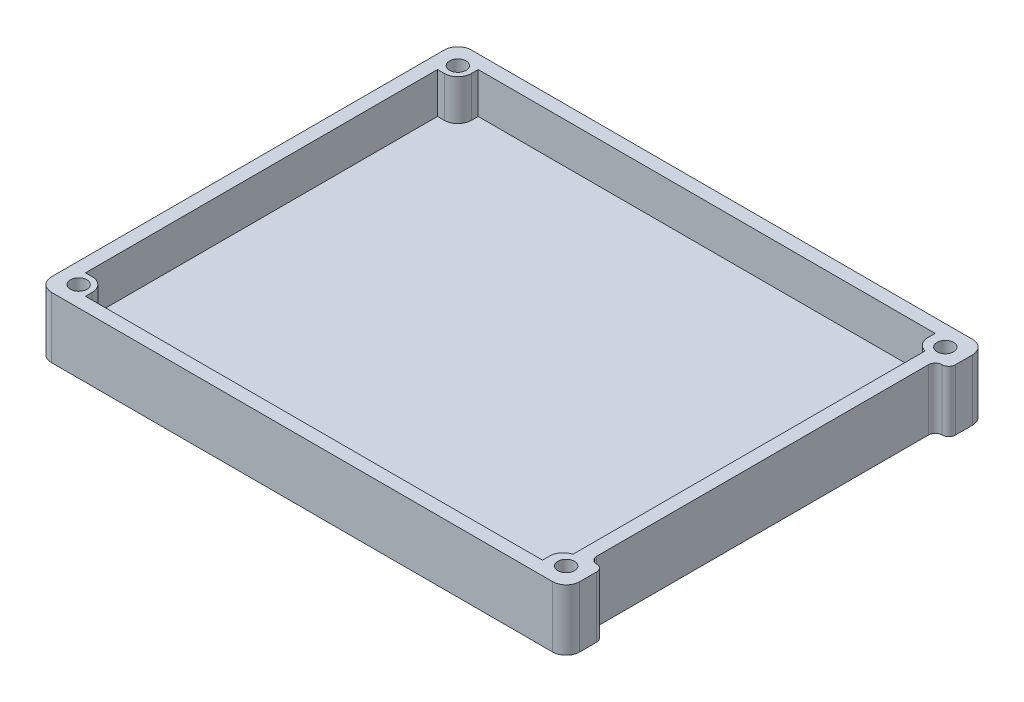
ISO-10303-21;
HEADER;
FILE_DESCRIPTION(('STEP AP214'),'2;1');
FILE_NAME('part.step','',(''),(''),'','','');
FILE_SCHEMA(('AUTOMOTIVE_DESIGN { 1 0 10303 214 1 1 1 1 }'));
ENDSEC;
DATA;
#1=APPLICATION_CONTEXT('core data for automotive mechanical design processes');
#2=APPLICATION_PROTOCOL_DEFINITION('international standard','automotive_design',2000,#1);
#3=PRODUCT_CONTEXT('',#1,'mechanical');
#4=PRODUCT('Part','Part','',(#3));
#5=PRODUCT_RELATED_PRODUCT_CATEGORY('part','',(#4));
#6=PRODUCT_DEFINITION_FORMATION('','',#4);
#7=PRODUCT_DEFINITION_CONTEXT('part definition',#1,'design');
#8=PRODUCT_DEFINITION('design','',#6,#7);
#9=PRODUCT_DEFINITION_SHAPE('','',#8);
#10=(LENGTH_UNIT() NAMED_UNIT(*) SI_UNIT(.MILLI.,.METRE.));
#11=(NAMED_UNIT(*) PLANE_ANGLE_UNIT() SI_UNIT($,.RADIAN.));
#12=(NAMED_UNIT(*) SI_UNIT($,.STERADIAN.) SOLID_ANGLE_UNIT());
#13=UNCERTAINTY_MEASURE_WITH_UNIT(LENGTH_MEASURE(1.E-05),#10,'distance_accuracy_value','');
#14=(GEOMETRIC_REPRESENTATION_CONTEXT(3) GLOBAL_UNCERTAINTY_ASSIGNED_CONTEXT((#13)) GLOBAL_UNIT_ASSIGNED_CONTEXT((#10,
#11,#12)) REPRESENTATION_CONTEXT('',''));
#15=CARTESIAN_POINT('',(0.,0.,0.));
#16=DIRECTION('',(0.,0.,1.));
#17=DIRECTION('',(1.,0.,0.));
#18=AXIS2_PLACEMENT_3D('',#15,#16,#17);
#19=CARTESIAN_POINT('',(40.5,-3.,-25.5));
#20=DIRECTION('',(-1.,0.,0.));
#21=DIRECTION('',(0.,0.,1.));
#22=AXIS2_PLACEMENT_3D('',#19,#20,#21);
#23=PLANE('',#22);
#24=DIRECTION('',(0.,0.,-1.));
#25=VECTOR('',#24,1.);
#26=CARTESIAN_POINT('',(40.5,6.,-25.5));
#27=LINE('',#26,#25);
#28=CARTESIAN_POINT('',(40.5,6.,-26.5));
#29=VERTEX_POINT('',#28);
#30=CARTESIAN_POINT('',(40.5,6.,-29.));
#31=VERTEX_POINT('',#30);
#32=EDGE_CURVE('E232',#29,#31,#27,.T.);
#33=ORIENTED_EDGE('',*,*,#32,.F.);
#34=DIRECTION('',(0.,1.,0.));
#35=VECTOR('',#34,1.);
#36=CARTESIAN_POINT('',(40.5,-3.,-26.5));
#37=LINE('',#36,#35);
#38=CARTESIAN_POINT('',(40.5,-3.,-26.5));
#39=VERTEX_POINT('',#38);
#40=EDGE_CURVE('E324',#29,#39,#37,.F.);
#41=ORIENTED_EDGE('',*,*,#40,.T.);
#42=DIRECTION('',(0.,0.,1.));
#43=VECTOR('',#42,1.);
#44=CARTESIAN_POINT('',(40.5,-3.,-25.5));
#45=LINE('',#44,#43);
#46=CARTESIAN_POINT('',(40.5,-3.,-29.));
#47=VERTEX_POINT('',#46);
#48=EDGE_CURVE('E361',#47,#39,#45,.T.);
#49=ORIENTED_EDGE('',*,*,#48,.F.);
#50=DIRECTION('',(0.,1.,0.));
#51=VECTOR('',#50,1.);
#52=CARTESIAN_POINT('',(40.5,-3.,-29.));
#53=LINE('',#52,#51);
#54=EDGE_CURVE('E278',#47,#31,#53,.T.);
#55=ORIENTED_EDGE('',*,*,#54,.T.);
#56=EDGE_LOOP('',(#33,#41,#49,#55));
#57=FACE_BOUND('',#56,.T.);
#58=ADVANCED_FACE('F36',(#57),#23,.F.);
#59=CARTESIAN_POINT('',(38.5,-3.,25.5));
#60=DIRECTION('',(-1.,0.,0.));
#61=DIRECTION('',(0.,0.,1.));
#62=AXIS2_PLACEMENT_3D('',#59,#60,#61);
#63=PLANE('',#62);
#64=DIRECTION('',(0.,0.,1.));
#65=VECTOR('',#64,1.);
#66=CARTESIAN_POINT('',(38.5,-3.,25.5));
#67=LINE('',#66,#65);
#68=CARTESIAN_POINT('',(38.5,-3.,-24.5));
#69=VERTEX_POINT('',#68);
#70=CARTESIAN_POINT('',(38.5,-3.,24.5));
#71=VERTEX_POINT('',#70);
#72=EDGE_CURVE('E365',#69,#71,#67,.T.);
#73=ORIENTED_EDGE('',*,*,#72,.F.);
#74=DIRECTION('',(0.,1.,0.));
#75=VECTOR('',#74,1.);
#76=CARTESIAN_POINT('',(38.5,6.,-24.5));
#77=LINE('',#76,#75);
#78=CARTESIAN_POINT('',(38.5,6.,-24.5));
#79=VERTEX_POINT('',#78);
#80=EDGE_CURVE('E317',#69,#79,#77,.T.);
#81=ORIENTED_EDGE('',*,*,#80,.T.);
#82=DIRECTION('',(0.,0.,-1.));
#83=VECTOR('',#82,1.);
#84=CARTESIAN_POINT('',(38.5,6.,-25.5));
#85=LINE('',#84,#83);
#86=CARTESIAN_POINT('',(38.5,6.,24.5));
#87=VERTEX_POINT('',#86);
#88=EDGE_CURVE('E355',#87,#79,#85,.T.);
#89=ORIENTED_EDGE('',*,*,#88,.F.);
#90=DIRECTION('',(0.,1.,0.));
#91=VECTOR('',#90,1.);
#92=CARTESIAN_POINT('',(38.5,-3.,24.5));
#93=LINE('',#92,#91);
#94=EDGE_CURVE('E315',#87,#71,#93,.F.);
#95=ORIENTED_EDGE('',*,*,#94,.T.);
#96=EDGE_LOOP('',(#73,#81,#89,#95));
#97=FACE_BOUND('',#96,.T.);
#98=ADVANCED_FACE('F359',(#97),#63,.F.);
#99=CARTESIAN_POINT('',(40.5,-3.,31.));
#100=DIRECTION('',(-1.,0.,0.));
#101=DIRECTION('',(0.,0.,1.));
#102=AXIS2_PLACEMENT_3D('',#99,#100,#101);
#103=PLANE('',#102);
#104=DIRECTION('',(0.,0.,1.));
#105=VECTOR('',#104,1.);
#106=CARTESIAN_POINT('',(40.5,-3.,31.));
#107=LINE('',#106,#105);
#108=CARTESIAN_POINT('',(40.5,-3.,26.5));
#109=VERTEX_POINT('',#108);
#110=CARTESIAN_POINT('',(40.5,-3.,29.));
#111=VERTEX_POINT('',#110);
#112=EDGE_CURVE('E372',#109,#111,#107,.T.);
#113=ORIENTED_EDGE('',*,*,#112,.F.);
#114=DIRECTION('',(0.,1.,0.));
#115=VECTOR('',#114,1.);
#116=CARTESIAN_POINT('',(40.5,-3.,26.5));
#117=LINE('',#116,#115);
#118=CARTESIAN_POINT('',(40.5,6.,26.5));
#119=VERTEX_POINT('',#118);
#120=EDGE_CURVE('E329',#109,#119,#117,.T.);
#121=ORIENTED_EDGE('',*,*,#120,.T.);
#122=DIRECTION('',(0.,0.,-1.));
#123=VECTOR('',#122,1.);
#124=CARTESIAN_POINT('',(40.5,6.,31.));
#125=LINE('',#124,#123);
#126=CARTESIAN_POINT('',(40.5,6.,29.));
#127=VERTEX_POINT('',#126);
#128=EDGE_CURVE('E362',#127,#119,#125,.T.);
#129=ORIENTED_EDGE('',*,*,#128,.F.);
#130=DIRECTION('',(0.,1.,0.));
#131=VECTOR('',#130,1.);
#132=CARTESIAN_POINT('',(40.5,-3.,29.));
#133=LINE('',#132,#131);
#134=EDGE_CURVE('E312',#127,#111,#133,.F.);
#135=ORIENTED_EDGE('',*,*,#134,.T.);
#136=EDGE_LOOP('',(#113,#121,#129,#135));
#137=FACE_BOUND('',#136,.T.);
#138=ADVANCED_FACE('F496',(#137),#103,.F.);
#139=CARTESIAN_POINT('',(-37.5,-3.,31.));
#140=DIRECTION('',(0.,0.,-1.));
#141=DIRECTION('',(-1.,0.,0.));
#142=AXIS2_PLACEMENT_3D('',#139,#140,#141);
#143=PLANE('',#142);
#144=DIRECTION('',(-1.,0.,0.));
#145=VECTOR('',#144,1.);
#146=CARTESIAN_POINT('',(-37.5,-3.,31.));
#147=LINE('',#146,#145);
#148=CARTESIAN_POINT('',(38.5,-3.,31.));
#149=VERTEX_POINT('',#148);
#150=CARTESIAN_POINT('',(-35.5,-3.,31.));
#151=VERTEX_POINT('',#150);
#152=EDGE_CURVE('E374',#149,#151,#147,.T.);
#153=ORIENTED_EDGE('',*,*,#152,.F.);
#154=DIRECTION('',(0.,1.,0.));
#155=VECTOR('',#154,1.);
#156=CARTESIAN_POINT('',(38.5,-3.,31.));
#157=LINE('',#156,#155);
#158=CARTESIAN_POINT('',(38.5,6.,31.));
#159=VERTEX_POINT('',#158);
#160=EDGE_CURVE('E309',#149,#159,#157,.T.);
#161=ORIENTED_EDGE('',*,*,#160,.T.);
#162=DIRECTION('',(1.,0.,0.));
#163=VECTOR('',#162,1.);
#164=CARTESIAN_POINT('',(-37.5,6.,31.));
#165=LINE('',#164,#163);
#166=CARTESIAN_POINT('',(-35.5,6.,31.));
#167=VERTEX_POINT('',#166);
#168=EDGE_CURVE('E367',#167,#159,#165,.T.);
#169=ORIENTED_EDGE('',*,*,#168,.F.);
#170=DIRECTION('',(0.,1.,0.));
#171=VECTOR('',#170,1.);
#172=CARTESIAN_POINT('',(-35.5,-3.,31.));
#173=LINE('',#172,#171);
#174=EDGE_CURVE('E307',#167,#151,#173,.F.);
#175=ORIENTED_EDGE('',*,*,#174,.T.);
#176=EDGE_LOOP('',(#153,#161,#169,#175));
#177=FACE_BOUND('',#176,.T.);
#178=ADVANCED_FACE('F448',(#177),#143,.F.);
#179=CARTESIAN_POINT('',(-37.5,-3.,31.));
#180=DIRECTION('',(1.,0.,0.));
#181=DIRECTION('',(0.,0.,-1.));
#182=AXIS2_PLACEMENT_3D('',#179,#180,#181);
#183=PLANE('',#182);
#184=DIRECTION('',(0.,0.,1.));
#185=VECTOR('',#184,1.);
#186=CARTESIAN_POINT('',(-37.5,6.,31.));
#187=LINE('',#186,#185);
#188=CARTESIAN_POINT('',(-37.5,6.,-29.));
#189=VERTEX_POINT('',#188);
#190=CARTESIAN_POINT('',(-37.5,6.,29.));
#191=VERTEX_POINT('',#190);
#192=EDGE_CURVE('E440',#189,#191,#187,.T.);
#193=ORIENTED_EDGE('',*,*,#192,.F.);
#194=DIRECTION('',(0.,1.,0.));
#195=VECTOR('',#194,1.);
#196=CARTESIAN_POINT('',(-37.5,-3.,-29.));
#197=LINE('',#196,#195);
#198=CARTESIAN_POINT('',(-37.5,-3.,-29.));
#199=VERTEX_POINT('',#198);
#200=EDGE_CURVE('E305',#189,#199,#197,.F.);
#201=ORIENTED_EDGE('',*,*,#200,.T.);
#202=DIRECTION('',(0.,0.,-1.));
#203=VECTOR('',#202,1.);
#204=CARTESIAN_POINT('',(-37.5,-3.,31.));
#205=LINE('',#204,#203);
#206=CARTESIAN_POINT('',(-37.5,-3.,29.));
#207=VERTEX_POINT('',#206);
#208=EDGE_CURVE('E377',#207,#199,#205,.T.);
#209=ORIENTED_EDGE('',*,*,#208,.F.);
#210=DIRECTION('',(0.,1.,0.));
#211=VECTOR('',#210,1.);
#212=CARTESIAN_POINT('',(-37.5,-3.,29.));
#213=LINE('',#212,#211);
#214=EDGE_CURVE('E302',#207,#191,#213,.T.);
#215=ORIENTED_EDGE('',*,*,#214,.T.);
#216=EDGE_LOOP('',(#193,#201,#209,#215));
#217=FACE_BOUND('',#216,.T.);
#218=ADVANCED_FACE('F459',(#217),#183,.F.);
#219=CARTESIAN_POINT('',(-37.5,-3.,-31.));
#220=DIRECTION('',(0.,0.,1.));
#221=DIRECTION('',(1.,0.,0.));
#222=AXIS2_PLACEMENT_3D('',#219,#220,#221);
#223=PLANE('',#222);
#224=DIRECTION('',(-1.,0.,0.));
#225=VECTOR('',#224,1.);
#226=CARTESIAN_POINT('',(-37.5,6.,-31.));
#227=LINE('',#226,#225);
#228=CARTESIAN_POINT('',(38.5,6.,-31.));
#229=VERTEX_POINT('',#228);
#230=CARTESIAN_POINT('',(-35.5,6.,-31.));
#231=VERTEX_POINT('',#230);
#232=EDGE_CURVE('E437',#229,#231,#227,.T.);
#233=ORIENTED_EDGE('',*,*,#232,.F.);
#234=DIRECTION('',(0.,1.,0.));
#235=VECTOR('',#234,1.);
#236=CARTESIAN_POINT('',(38.5,-3.,-31.));
#237=LINE('',#236,#235);
#238=CARTESIAN_POINT('',(38.5,-3.,-31.));
#239=VERTEX_POINT('',#238);
#240=EDGE_CURVE('E292',#229,#239,#237,.F.);
#241=ORIENTED_EDGE('',*,*,#240,.T.);
#242=DIRECTION('',(1.,0.,0.));
#243=VECTOR('',#242,1.);
#244=CARTESIAN_POINT('',(-37.5,-3.,-31.));
#245=LINE('',#244,#243);
#246=CARTESIAN_POINT('',(-35.5,-3.,-31.));
#247=VERTEX_POINT('',#246);
#248=EDGE_CURVE('E380',#247,#239,#245,.T.);
#249=ORIENTED_EDGE('',*,*,#248,.F.);
#250=DIRECTION('',(0.,1.,0.));
#251=VECTOR('',#250,1.);
#252=CARTESIAN_POINT('',(-35.5,-3.,-31.));
#253=LINE('',#252,#251);
#254=EDGE_CURVE('E289',#247,#231,#253,.T.);
#255=ORIENTED_EDGE('',*,*,#254,.T.);
#256=EDGE_LOOP('',(#233,#241,#249,#255));
#257=FACE_BOUND('',#256,.T.);
#258=ADVANCED_FACE('F468',(#257),#223,.F.);
#259=CARTESIAN_POINT('',(0.,-3.,0.));
#260=DIRECTION('',(0.,-1.,0.));
#261=DIRECTION('',(0.,0.,-1.));
#262=AXIS2_PLACEMENT_3D('',#259,#260,#261);
#263=PLANE('',#262);
#264=CARTESIAN_POINT('',(37.5,-3.,-28.));
#265=DIRECTION('',(0.,-1.,0.));
#266=DIRECTION('',(0.,0.,-1.));
#267=AXIS2_PLACEMENT_3D('',#264,#265,#266);
#268=CIRCLE('',#267,2.5019);
#269=CARTESIAN_POINT('',(37.5,-3.,-30.5019));
#270=VERTEX_POINT('',#269);
#271=EDGE_CURVE('E338',#270,#270,#268,.T.);
#272=ORIENTED_EDGE('',*,*,#271,.F.);
#273=EDGE_LOOP('',(#272));
#274=FACE_BOUND('',#273,.T.);
#275=CARTESIAN_POINT('',(-34.5,-3.,-28.));
#276=DIRECTION('',(0.,-1.,0.));
#277=DIRECTION('',(0.,0.,-1.));
#278=AXIS2_PLACEMENT_3D('',#275,#276,#277);
#279=CIRCLE('',#278,2.5019);
#280=CARTESIAN_POINT('',(-34.5,-3.,-30.5019));
#281=VERTEX_POINT('',#280);
#282=EDGE_CURVE('E923',#281,#281,#279,.T.);
#283=ORIENTED_EDGE('',*,*,#282,.F.);
#284=EDGE_LOOP('',(#283));
#285=FACE_BOUND('',#284,.T.);
#286=CARTESIAN_POINT('',(-34.5,-3.,28.));
#287=DIRECTION('',(0.,-1.,0.));
#288=DIRECTION('',(0.,0.,-1.));
#289=AXIS2_PLACEMENT_3D('',#286,#287,#288);
#290=CIRCLE('',#289,2.5019);
#291=CARTESIAN_POINT('',(-34.5,-3.,25.4981));
#292=VERTEX_POINT('',#291);
#293=EDGE_CURVE('E927',#292,#292,#290,.T.);
#294=ORIENTED_EDGE('',*,*,#293,.F.);
#295=EDGE_LOOP('',(#294));
#296=FACE_BOUND('',#295,.T.);
#297=CARTESIAN_POINT('',(37.5,-3.,28.));
#298=DIRECTION('',(0.,-1.,0.));
#299=DIRECTION('',(0.,0.,-1.));
#300=AXIS2_PLACEMENT_3D('',#297,#298,#299);
#301=CIRCLE('',#300,2.5019);
#302=CARTESIAN_POINT('',(37.5,-3.,25.4981));
#303=VERTEX_POINT('',#302);
#304=EDGE_CURVE('E930',#303,#303,#301,.T.);
#305=ORIENTED_EDGE('',*,*,#304,.F.);
#306=EDGE_LOOP('',(#305));
#307=FACE_BOUND('',#306,.T.);
#308=ORIENTED_EDGE('',*,*,#48,.T.);
#309=CARTESIAN_POINT('',(39.5,-3.,-26.5));
#310=DIRECTION('',(0.,-1.,0.));
#311=DIRECTION('',(0.,0.,-1.));
#312=AXIS2_PLACEMENT_3D('',#309,#310,#311);
#313=CIRCLE('',#312,1.);
#314=CARTESIAN_POINT('',(39.5,-3.,-25.5));
#315=VERTEX_POINT('',#314);
#316=EDGE_CURVE('E327',#39,#315,#313,.T.);
#317=ORIENTED_EDGE('',*,*,#316,.T.);
#318=CARTESIAN_POINT('',(39.5,-3.,-24.5));
#319=DIRECTION('',(0.,-1.,0.));
#320=DIRECTION('',(0.,0.,-1.));
#321=AXIS2_PLACEMENT_3D('',#318,#319,#320);
#322=CIRCLE('',#321,1.);
#323=EDGE_CURVE('E334',#315,#69,#322,.F.);
#324=ORIENTED_EDGE('',*,*,#323,.T.);
#325=ORIENTED_EDGE('',*,*,#72,.T.);
#326=CARTESIAN_POINT('',(39.5,-3.,24.5));
#327=DIRECTION('',(0.,-1.,0.));
#328=DIRECTION('',(0.,0.,-1.));
#329=AXIS2_PLACEMENT_3D('',#326,#327,#328);
#330=CIRCLE('',#329,1.);
#331=CARTESIAN_POINT('',(39.5,-3.,25.5));
#332=VERTEX_POINT('',#331);
#333=EDGE_CURVE('E11',#71,#332,#330,.F.);
#334=ORIENTED_EDGE('',*,*,#333,.T.);
#335=CARTESIAN_POINT('',(39.5,-3.,26.5));
#336=DIRECTION('',(0.,-1.,0.));
#337=DIRECTION('',(0.,0.,-1.));
#338=AXIS2_PLACEMENT_3D('',#335,#336,#337);
#339=CIRCLE('',#338,1.);
#340=EDGE_CURVE('E52',#332,#109,#339,.T.);
#341=ORIENTED_EDGE('',*,*,#340,.T.);
#342=ORIENTED_EDGE('',*,*,#112,.T.);
#343=CARTESIAN_POINT('',(38.5,-3.,29.));
#344=DIRECTION('',(0.,-1.,0.));
#345=DIRECTION('',(0.,0.,-1.));
#346=AXIS2_PLACEMENT_3D('',#343,#344,#345);
#347=CIRCLE('',#346,2.);
#348=EDGE_CURVE('E296',#111,#149,#347,.T.);
#349=ORIENTED_EDGE('',*,*,#348,.T.);
#350=ORIENTED_EDGE('',*,*,#152,.T.);
#351=CARTESIAN_POINT('',(-35.5,-3.,29.));
#352=DIRECTION('',(0.,-1.,0.));
#353=DIRECTION('',(0.,0.,-1.));
#354=AXIS2_PLACEMENT_3D('',#351,#352,#353);
#355=CIRCLE('',#354,2.);
#356=EDGE_CURVE('E294',#151,#207,#355,.T.);
#357=ORIENTED_EDGE('',*,*,#356,.T.);
#358=ORIENTED_EDGE('',*,*,#208,.T.);
#359=CARTESIAN_POINT('',(-35.5,-3.,-29.));
#360=DIRECTION('',(0.,-1.,0.));
#361=DIRECTION('',(0.,0.,-1.));
#362=AXIS2_PLACEMENT_3D('',#359,#360,#361);
#363=CIRCLE('',#362,2.);
#364=EDGE_CURVE('E298',#199,#247,#363,.T.);
#365=ORIENTED_EDGE('',*,*,#364,.T.);
#366=ORIENTED_EDGE('',*,*,#248,.T.);
#367=CARTESIAN_POINT('',(38.5,-3.,-29.));
#368=DIRECTION('',(0.,-1.,0.));
#369=DIRECTION('',(0.,0.,-1.));
#370=AXIS2_PLACEMENT_3D('',#367,#368,#369);
#371=CIRCLE('',#370,2.);
#372=EDGE_CURVE('E300',#239,#47,#371,.T.);
#373=ORIENTED_EDGE('',*,*,#372,.T.);
#374=EDGE_LOOP('',(#308,#317,#324,#325,#334,#341,#342,#349,#350,#357,#358,#365,#366,#373));
#375=FACE_BOUND('',#374,.T.);
#376=ADVANCED_FACE('F455',(#274,#285,#296,#307,#375),#263,.T.);
#377=CARTESIAN_POINT('',(0.,6.,0.));
#378=DIRECTION('',(0.,-1.,0.));
#379=DIRECTION('',(0.,0.,-1.));
#380=AXIS2_PLACEMENT_3D('',#377,#378,#379);
#381=PLANE('',#380);
#382=CARTESIAN_POINT('',(37.5,6.,-28.));
#383=DIRECTION('',(0.,-1.,0.));
#384=DIRECTION('',(0.,0.,-1.));
#385=AXIS2_PLACEMENT_3D('',#382,#383,#384);
#386=CIRCLE('',#385,1.2192);
#387=CARTESIAN_POINT('',(37.5,6.,-29.2192));
#388=VERTEX_POINT('',#387);
#389=EDGE_CURVE('E998',#388,#388,#386,.T.);
#390=ORIENTED_EDGE('',*,*,#389,.T.);
#391=EDGE_LOOP('',(#390));
#392=FACE_BOUND('',#391,.T.);
#393=CARTESIAN_POINT('',(-34.5,6.,-28.));
#394=DIRECTION('',(0.,-1.,0.));
#395=DIRECTION('',(0.,0.,-1.));
#396=AXIS2_PLACEMENT_3D('',#393,#394,#395);
#397=CIRCLE('',#396,1.2192);
#398=CARTESIAN_POINT('',(-34.5,6.,-29.2192));
#399=VERTEX_POINT('',#398);
#400=EDGE_CURVE('E991',#399,#399,#397,.T.);
#401=ORIENTED_EDGE('',*,*,#400,.T.);
#402=EDGE_LOOP('',(#401));
#403=FACE_BOUND('',#402,.T.);
#404=CARTESIAN_POINT('',(-34.5,6.,28.));
#405=DIRECTION('',(0.,-1.,0.));
#406=DIRECTION('',(0.,0.,-1.));
#407=AXIS2_PLACEMENT_3D('',#404,#405,#406);
#408=CIRCLE('',#407,1.2192);
#409=CARTESIAN_POINT('',(-34.5,6.,26.7808));
#410=VERTEX_POINT('',#409);
#411=EDGE_CURVE('E933',#410,#410,#408,.T.);
#412=ORIENTED_EDGE('',*,*,#411,.T.);
#413=EDGE_LOOP('',(#412));
#414=FACE_BOUND('',#413,.T.);
#415=CARTESIAN_POINT('',(37.5,6.,28.));
#416=DIRECTION('',(0.,-1.,0.));
#417=DIRECTION('',(0.,0.,-1.));
#418=AXIS2_PLACEMENT_3D('',#415,#416,#417);
#419=CIRCLE('',#418,1.2192);
#420=CARTESIAN_POINT('',(37.5,6.,26.7808));
#421=VERTEX_POINT('',#420);
#422=EDGE_CURVE('E936',#421,#421,#419,.T.);
#423=ORIENTED_EDGE('',*,*,#422,.T.);
#424=EDGE_LOOP('',(#423));
#425=FACE_BOUND('',#424,.T.);
#426=ORIENTED_EDGE('',*,*,#88,.T.);
#427=CARTESIAN_POINT('',(39.5,6.,-24.5));
#428=DIRECTION('',(0.,-1.,0.));
#429=DIRECTION('',(0.,0.,-1.));
#430=AXIS2_PLACEMENT_3D('',#427,#428,#429);
#431=CIRCLE('',#430,1.);
#432=CARTESIAN_POINT('',(39.5,6.,-25.5));
#433=VERTEX_POINT('',#432);
#434=EDGE_CURVE('E332',#79,#433,#431,.T.);
#435=ORIENTED_EDGE('',*,*,#434,.T.);
#436=CARTESIAN_POINT('',(39.5,6.,-26.5));
#437=DIRECTION('',(0.,-1.,0.));
#438=DIRECTION('',(0.,0.,-1.));
#439=AXIS2_PLACEMENT_3D('',#436,#437,#438);
#440=CIRCLE('',#439,1.);
#441=EDGE_CURVE('E322',#433,#29,#440,.F.);
#442=ORIENTED_EDGE('',*,*,#441,.T.);
#443=ORIENTED_EDGE('',*,*,#32,.T.);
#444=CARTESIAN_POINT('',(38.5,6.,-29.));
#445=DIRECTION('',(0.,-1.,0.));
#446=DIRECTION('',(0.,0.,-1.));
#447=AXIS2_PLACEMENT_3D('',#444,#445,#446);
#448=CIRCLE('',#447,2.);
#449=EDGE_CURVE('E287',#31,#229,#448,.F.);
#450=ORIENTED_EDGE('',*,*,#449,.T.);
#451=ORIENTED_EDGE('',*,*,#232,.T.);
#452=CARTESIAN_POINT('',(-35.5,6.,-29.));
#453=DIRECTION('',(0.,-1.,0.));
#454=DIRECTION('',(0.,0.,-1.));
#455=AXIS2_PLACEMENT_3D('',#452,#453,#454);
#456=CIRCLE('',#455,2.);
#457=EDGE_CURVE('E285',#231,#189,#456,.F.);
#458=ORIENTED_EDGE('',*,*,#457,.T.);
#459=ORIENTED_EDGE('',*,*,#192,.T.);
#460=CARTESIAN_POINT('',(-35.5,6.,29.));
#461=DIRECTION('',(0.,-1.,0.));
#462=DIRECTION('',(0.,0.,-1.));
#463=AXIS2_PLACEMENT_3D('',#460,#461,#462);
#464=CIRCLE('',#463,2.);
#465=EDGE_CURVE('E281',#191,#167,#464,.F.);
#466=ORIENTED_EDGE('',*,*,#465,.T.);
#467=ORIENTED_EDGE('',*,*,#168,.T.);
#468=CARTESIAN_POINT('',(38.5,6.,29.));
#469=DIRECTION('',(0.,-1.,0.));
#470=DIRECTION('',(0.,0.,-1.));
#471=AXIS2_PLACEMENT_3D('',#468,#469,#470);
#472=CIRCLE('',#471,2.);
#473=EDGE_CURVE('E283',#159,#127,#472,.F.);
#474=ORIENTED_EDGE('',*,*,#473,.T.);
#475=ORIENTED_EDGE('',*,*,#128,.T.);
#476=CARTESIAN_POINT('',(39.5,6.,26.5));
#477=DIRECTION('',(0.,-1.,0.));
#478=DIRECTION('',(0.,0.,-1.));
#479=AXIS2_PLACEMENT_3D('',#476,#477,#478);
#480=CIRCLE('',#479,1.);
#481=CARTESIAN_POINT('',(39.5,6.,25.5));
#482=VERTEX_POINT('',#481);
#483=EDGE_CURVE('E320',#119,#482,#480,.F.);
#484=ORIENTED_EDGE('',*,*,#483,.T.);
#485=CARTESIAN_POINT('',(39.5,6.,24.5));
#486=DIRECTION('',(0.,-1.,0.));
#487=DIRECTION('',(0.,0.,-1.));
#488=AXIS2_PLACEMENT_3D('',#485,#486,#487);
#489=CIRCLE('',#488,1.);
#490=EDGE_CURVE('E45',#482,#87,#489,.T.);
#491=ORIENTED_EDGE('',*,*,#490,.T.);
#492=EDGE_LOOP('',(#426,#435,#442,#443,#450,#451,#458,#459,#466,#467,#474,#475,#484,#491));
#493=FACE_BOUND('',#492,.T.);
#494=DIRECTION('',(-1.,0.,0.));
#495=VECTOR('',#494,1.);
#496=CARTESIAN_POINT('',(-35.5,6.,-26.));
#497=LINE('',#496,#495);
#498=CARTESIAN_POINT('',(-34.5,6.,-26.));
#499=VERTEX_POINT('',#498);
#500=CARTESIAN_POINT('',(-35.5,6.,-26.));
#501=VERTEX_POINT('',#500);
#502=EDGE_CURVE('E951',#499,#501,#497,.T.);
#503=ORIENTED_EDGE('',*,*,#502,.F.);
#504=CARTESIAN_POINT('',(-34.5,6.,-28.));
#505=DIRECTION('',(0.,-1.,0.));
#506=DIRECTION('',(0.,0.,-1.));
#507=AXIS2_PLACEMENT_3D('',#504,#505,#506);
#508=CIRCLE('',#507,2.);
#509=CARTESIAN_POINT('',(-32.5,6.,-28.));
#510=VERTEX_POINT('',#509);
#511=EDGE_CURVE('E260',#499,#510,#508,.F.);
#512=ORIENTED_EDGE('',*,*,#511,.T.);
#513=DIRECTION('',(0.,0.,1.));
#514=VECTOR('',#513,1.);
#515=CARTESIAN_POINT('',(-32.5,6.,-29.));
#516=LINE('',#515,#514);
#517=CARTESIAN_POINT('',(-32.5,6.,-29.));
#518=VERTEX_POINT('',#517);
#519=EDGE_CURVE('E393',#518,#510,#516,.T.);
#520=ORIENTED_EDGE('',*,*,#519,.F.);
#521=DIRECTION('',(-1.,0.,0.));
#522=VECTOR('',#521,1.);
#523=CARTESIAN_POINT('',(-32.5,6.,-29.));
#524=LINE('',#523,#522);
#525=CARTESIAN_POINT('',(35.,6.,-29.));
#526=VERTEX_POINT('',#525);
#527=EDGE_CURVE('E948',#526,#518,#524,.T.);
#528=ORIENTED_EDGE('',*,*,#527,.F.);
#529=DIRECTION('',(0.,0.,-1.));
#530=VECTOR('',#529,1.);
#531=CARTESIAN_POINT('',(35.,6.,-29.));
#532=LINE('',#531,#530);
#533=CARTESIAN_POINT('',(35.,6.,-27.9364916731037));
#534=VERTEX_POINT('',#533);
#535=EDGE_CURVE('E244',#534,#526,#532,.T.);
#536=ORIENTED_EDGE('',*,*,#535,.F.);
#537=CARTESIAN_POINT('',(37.,6.,-27.9364916731037));
#538=DIRECTION('',(0.,-1.,0.));
#539=DIRECTION('',(0.,0.,-1.));
#540=AXIS2_PLACEMENT_3D('',#537,#538,#539);
#541=CIRCLE('',#540,2.);
#542=CARTESIAN_POINT('',(36.5,6.,-26.));
#543=VERTEX_POINT('',#542);
#544=EDGE_CURVE('E243',#534,#543,#541,.F.);
#545=ORIENTED_EDGE('',*,*,#544,.T.);
#546=DIRECTION('',(0.,0.,-1.));
#547=VECTOR('',#546,1.);
#548=CARTESIAN_POINT('',(36.5,6.,26.));
#549=LINE('',#548,#547);
#550=CARTESIAN_POINT('',(36.5,6.,26.));
#551=VERTEX_POINT('',#550);
#552=EDGE_CURVE('E226',#551,#543,#549,.T.);
#553=ORIENTED_EDGE('',*,*,#552,.F.);
#554=CARTESIAN_POINT('',(37.,6.,27.9364916731037));
#555=DIRECTION('',(0.,-1.,0.));
#556=DIRECTION('',(0.,0.,-1.));
#557=AXIS2_PLACEMENT_3D('',#554,#555,#556);
#558=CIRCLE('',#557,2.);
#559=CARTESIAN_POINT('',(35.,6.,27.9364916731037));
#560=VERTEX_POINT('',#559);
#561=EDGE_CURVE('E239',#551,#560,#558,.F.);
#562=ORIENTED_EDGE('',*,*,#561,.T.);
#563=DIRECTION('',(0.,0.,-1.));
#564=VECTOR('',#563,1.);
#565=CARTESIAN_POINT('',(35.,6.,29.));
#566=LINE('',#565,#564);
#567=CARTESIAN_POINT('',(35.,6.,29.));
#568=VERTEX_POINT('',#567);
#569=EDGE_CURVE('E245',#568,#560,#566,.T.);
#570=ORIENTED_EDGE('',*,*,#569,.F.);
#571=DIRECTION('',(1.,0.,0.));
#572=VECTOR('',#571,1.);
#573=CARTESIAN_POINT('',(-32.5,6.,29.));
#574=LINE('',#573,#572);
#575=CARTESIAN_POINT('',(-32.5,6.,29.));
#576=VERTEX_POINT('',#575);
#577=EDGE_CURVE('E422',#576,#568,#574,.T.);
#578=ORIENTED_EDGE('',*,*,#577,.F.);
#579=DIRECTION('',(0.,0.,1.));
#580=VECTOR('',#579,1.);
#581=CARTESIAN_POINT('',(-32.5,6.,29.));
#582=LINE('',#581,#580);
#583=CARTESIAN_POINT('',(-32.5,6.,28.));
#584=VERTEX_POINT('',#583);
#585=EDGE_CURVE('E958',#584,#576,#582,.T.);
#586=ORIENTED_EDGE('',*,*,#585,.F.);
#587=CARTESIAN_POINT('',(-34.5,6.,28.));
#588=DIRECTION('',(0.,-1.,0.));
#589=DIRECTION('',(0.,0.,-1.));
#590=AXIS2_PLACEMENT_3D('',#587,#588,#589);
#591=CIRCLE('',#590,2.);
#592=CARTESIAN_POINT('',(-34.5,6.,26.));
#593=VERTEX_POINT('',#592);
#594=EDGE_CURVE('E251',#584,#593,#591,.F.);
#595=ORIENTED_EDGE('',*,*,#594,.T.);
#596=DIRECTION('',(1.,0.,0.));
#597=VECTOR('',#596,1.);
#598=CARTESIAN_POINT('',(-35.5,6.,26.));
#599=LINE('',#598,#597);
#600=CARTESIAN_POINT('',(-35.5,6.,26.));
#601=VERTEX_POINT('',#600);
#602=EDGE_CURVE('E955',#601,#593,#599,.T.);
#603=ORIENTED_EDGE('',*,*,#602,.F.);
#604=DIRECTION('',(0.,0.,1.));
#605=VECTOR('',#604,1.);
#606=CARTESIAN_POINT('',(-35.5,6.,26.));
#607=LINE('',#606,#605);
#608=EDGE_CURVE('E953',#501,#601,#607,.T.);
#609=ORIENTED_EDGE('',*,*,#608,.F.);
#610=EDGE_LOOP('',(#503,#512,#520,#528,#536,#545,#553,#562,#570,#578,#586,#595,#603,#609));
#611=FACE_BOUND('',#610,.T.);
#612=ADVANCED_FACE('F237',(#392,#403,#414,#425,#493,#611),#381,.F.);
#613=CARTESIAN_POINT('',(35.,6.,29.));
#614=DIRECTION('',(-1.,0.,0.));
#615=DIRECTION('',(0.,0.,1.));
#616=AXIS2_PLACEMENT_3D('',#613,#614,#615);
#617=PLANE('',#616);
#618=ORIENTED_EDGE('',*,*,#569,.T.);
#619=DIRECTION('',(0.,-1.,0.));
#620=VECTOR('',#619,1.);
#621=CARTESIAN_POINT('',(35.,0.,27.9364916731037));
#622=LINE('',#621,#620);
#623=CARTESIAN_POINT('',(35.,0.,27.9364916731037));
#624=VERTEX_POINT('',#623);
#625=EDGE_CURVE('E250',#560,#624,#622,.T.);
#626=ORIENTED_EDGE('',*,*,#625,.T.);
#627=DIRECTION('',(0.,0.,-1.));
#628=VECTOR('',#627,1.);
#629=CARTESIAN_POINT('',(35.,0.,29.));
#630=LINE('',#629,#628);
#631=CARTESIAN_POINT('',(35.,0.,29.));
#632=VERTEX_POINT('',#631);
#633=EDGE_CURVE('E945',#632,#624,#630,.T.);
#634=ORIENTED_EDGE('',*,*,#633,.F.);
#635=DIRECTION('',(0.,-1.,0.));
#636=VECTOR('',#635,1.);
#637=CARTESIAN_POINT('',(35.,6.,29.));
#638=LINE('',#637,#636);
#639=EDGE_CURVE('E419',#568,#632,#638,.T.);
#640=ORIENTED_EDGE('',*,*,#639,.F.);
#641=EDGE_LOOP('',(#618,#626,#634,#640));
#642=FACE_BOUND('',#641,.T.);
#643=ADVANCED_FACE('F768',(#642),#617,.T.);
#644=CARTESIAN_POINT('',(36.5,6.,26.));
#645=DIRECTION('',(-1.,0.,0.));
#646=DIRECTION('',(0.,0.,1.));
#647=AXIS2_PLACEMENT_3D('',#644,#645,#646);
#648=PLANE('',#647);
#649=DIRECTION('',(0.,0.,-1.));
#650=VECTOR('',#649,1.);
#651=CARTESIAN_POINT('',(36.5,0.,26.));
#652=LINE('',#651,#650);
#653=CARTESIAN_POINT('',(36.5,0.,26.));
#654=VERTEX_POINT('',#653);
#655=CARTESIAN_POINT('',(36.5,0.,-26.));
#656=VERTEX_POINT('',#655);
#657=EDGE_CURVE('E229',#654,#656,#652,.T.);
#658=ORIENTED_EDGE('',*,*,#657,.F.);
#659=DIRECTION('',(0.,-1.,0.));
#660=VECTOR('',#659,1.);
#661=CARTESIAN_POINT('',(36.5,6.,26.));
#662=LINE('',#661,#660);
#663=EDGE_CURVE('E222',#551,#654,#662,.T.);
#664=ORIENTED_EDGE('',*,*,#663,.F.);
#665=ORIENTED_EDGE('',*,*,#552,.T.);
#666=DIRECTION('',(0.,-1.,0.));
#667=VECTOR('',#666,1.);
#668=CARTESIAN_POINT('',(36.5,6.,-26.));
#669=LINE('',#668,#667);
#670=EDGE_CURVE('E233',#543,#656,#669,.T.);
#671=ORIENTED_EDGE('',*,*,#670,.T.);
#672=EDGE_LOOP('',(#658,#664,#665,#671));
#673=FACE_BOUND('',#672,.T.);
#674=ADVANCED_FACE('F224',(#673),#648,.T.);
#675=CARTESIAN_POINT('',(35.,6.,-29.));
#676=DIRECTION('',(-1.,0.,0.));
#677=DIRECTION('',(0.,0.,1.));
#678=AXIS2_PLACEMENT_3D('',#675,#676,#677);
#679=PLANE('',#678);
#680=DIRECTION('',(0.,0.,-1.));
#681=VECTOR('',#680,1.);
#682=CARTESIAN_POINT('',(35.,0.,-29.));
#683=LINE('',#682,#681);
#684=CARTESIAN_POINT('',(35.,0.,-27.9364916731037));
#685=VERTEX_POINT('',#684);
#686=CARTESIAN_POINT('',(35.,0.,-29.));
#687=VERTEX_POINT('',#686);
#688=EDGE_CURVE('E406',#685,#687,#683,.T.);
#689=ORIENTED_EDGE('',*,*,#688,.F.);
#690=DIRECTION('',(0.,1.,0.));
#691=VECTOR('',#690,1.);
#692=CARTESIAN_POINT('',(35.,6.,-27.9364916731037));
#693=LINE('',#692,#691);
#694=EDGE_CURVE('E262',#685,#534,#693,.T.);
#695=ORIENTED_EDGE('',*,*,#694,.T.);
#696=ORIENTED_EDGE('',*,*,#535,.T.);
#697=DIRECTION('',(0.,-1.,0.));
#698=VECTOR('',#697,1.);
#699=CARTESIAN_POINT('',(35.,6.,-29.));
#700=LINE('',#699,#698);
#701=EDGE_CURVE('E432',#526,#687,#700,.T.);
#702=ORIENTED_EDGE('',*,*,#701,.T.);
#703=EDGE_LOOP('',(#689,#695,#696,#702));
#704=FACE_BOUND('',#703,.T.);
#705=ADVANCED_FACE('F750',(#704),#679,.T.);
#706=CARTESIAN_POINT('',(-32.5,6.,-29.));
#707=DIRECTION('',(0.,0.,1.));
#708=DIRECTION('',(0.,-1.,0.));
#709=AXIS2_PLACEMENT_3D('',#706,#707,#708);
#710=PLANE('',#709);
#711=DIRECTION('',(-1.,0.,0.));
#712=VECTOR('',#711,1.);
#713=CARTESIAN_POINT('',(-32.5,0.,-29.));
#714=LINE('',#713,#712);
#715=CARTESIAN_POINT('',(-32.5,0.,-29.));
#716=VERTEX_POINT('',#715);
#717=EDGE_CURVE('E401',#687,#716,#714,.T.);
#718=ORIENTED_EDGE('',*,*,#717,.F.);
#719=ORIENTED_EDGE('',*,*,#701,.F.);
#720=ORIENTED_EDGE('',*,*,#527,.T.);
#721=DIRECTION('',(0.,-1.,0.));
#722=VECTOR('',#721,1.);
#723=CARTESIAN_POINT('',(-32.5,6.,-29.));
#724=LINE('',#723,#722);
#725=EDGE_CURVE('E430',#518,#716,#724,.T.);
#726=ORIENTED_EDGE('',*,*,#725,.T.);
#727=EDGE_LOOP('',(#718,#719,#720,#726));
#728=FACE_BOUND('',#727,.T.);
#729=ADVANCED_FACE('F741',(#728),#710,.T.);
#730=CARTESIAN_POINT('',(-32.5,6.,-29.));
#731=DIRECTION('',(1.,0.,0.));
#732=DIRECTION('',(0.,0.,-1.));
#733=AXIS2_PLACEMENT_3D('',#730,#731,#732);
#734=PLANE('',#733);
#735=ORIENTED_EDGE('',*,*,#519,.T.);
#736=DIRECTION('',(0.,-1.,0.));
#737=VECTOR('',#736,1.);
#738=CARTESIAN_POINT('',(-32.5,6.,-28.));
#739=LINE('',#738,#737);
#740=CARTESIAN_POINT('',(-32.5,0.,-28.));
#741=VERTEX_POINT('',#740);
#742=EDGE_CURVE('E255',#510,#741,#739,.T.);
#743=ORIENTED_EDGE('',*,*,#742,.T.);
#744=DIRECTION('',(0.,0.,1.));
#745=VECTOR('',#744,1.);
#746=CARTESIAN_POINT('',(-32.5,0.,-29.));
#747=LINE('',#746,#745);
#748=EDGE_CURVE('E390',#716,#741,#747,.T.);
#749=ORIENTED_EDGE('',*,*,#748,.F.);
#750=ORIENTED_EDGE('',*,*,#725,.F.);
#751=EDGE_LOOP('',(#735,#743,#749,#750));
#752=FACE_BOUND('',#751,.T.);
#753=ADVANCED_FACE('F388',(#752),#734,.T.);
#754=CARTESIAN_POINT('',(-35.5,6.,-26.));
#755=DIRECTION('',(0.,0.,1.));
#756=DIRECTION('',(0.,-1.,0.));
#757=AXIS2_PLACEMENT_3D('',#754,#755,#756);
#758=PLANE('',#757);
#759=DIRECTION('',(-1.,0.,0.));
#760=VECTOR('',#759,1.);
#761=CARTESIAN_POINT('',(-35.5,0.,-26.));
#762=LINE('',#761,#760);
#763=CARTESIAN_POINT('',(-34.5,0.,-26.));
#764=VERTEX_POINT('',#763);
#765=CARTESIAN_POINT('',(-35.5,0.,-26.));
#766=VERTEX_POINT('',#765);
#767=EDGE_CURVE('E402',#764,#766,#762,.T.);
#768=ORIENTED_EDGE('',*,*,#767,.F.);
#769=DIRECTION('',(0.,-1.,0.));
#770=VECTOR('',#769,1.);
#771=CARTESIAN_POINT('',(-34.5,6.,-26.));
#772=LINE('',#771,#770);
#773=EDGE_CURVE('E252',#764,#499,#772,.F.);
#774=ORIENTED_EDGE('',*,*,#773,.T.);
#775=ORIENTED_EDGE('',*,*,#502,.T.);
#776=DIRECTION('',(0.,-1.,0.));
#777=VECTOR('',#776,1.);
#778=CARTESIAN_POINT('',(-35.5,6.,-26.));
#779=LINE('',#778,#777);
#780=EDGE_CURVE('E427',#501,#766,#779,.T.);
#781=ORIENTED_EDGE('',*,*,#780,.T.);
#782=EDGE_LOOP('',(#768,#774,#775,#781));
#783=FACE_BOUND('',#782,.T.);
#784=ADVANCED_FACE('F722',(#783),#758,.T.);
#785=CARTESIAN_POINT('',(-35.5,6.,26.));
#786=DIRECTION('',(1.,0.,0.));
#787=DIRECTION('',(0.,0.,-1.));
#788=AXIS2_PLACEMENT_3D('',#785,#786,#787);
#789=PLANE('',#788);
#790=DIRECTION('',(0.,0.,1.));
#791=VECTOR('',#790,1.);
#792=CARTESIAN_POINT('',(-35.5,0.,26.));
#793=LINE('',#792,#791);
#794=CARTESIAN_POINT('',(-35.5,0.,26.));
#795=VERTEX_POINT('',#794);
#796=EDGE_CURVE('E404',#766,#795,#793,.T.);
#797=ORIENTED_EDGE('',*,*,#796,.F.);
#798=ORIENTED_EDGE('',*,*,#780,.F.);
#799=ORIENTED_EDGE('',*,*,#608,.T.);
#800=DIRECTION('',(0.,-1.,0.));
#801=VECTOR('',#800,1.);
#802=CARTESIAN_POINT('',(-35.5,6.,26.));
#803=LINE('',#802,#801);
#804=EDGE_CURVE('E425',#601,#795,#803,.T.);
#805=ORIENTED_EDGE('',*,*,#804,.T.);
#806=EDGE_LOOP('',(#797,#798,#799,#805));
#807=FACE_BOUND('',#806,.T.);
#808=ADVANCED_FACE('F712',(#807),#789,.T.);
#809=CARTESIAN_POINT('',(-35.5,6.,26.));
#810=DIRECTION('',(0.,0.,-1.));
#811=DIRECTION('',(0.,1.,0.));
#812=AXIS2_PLACEMENT_3D('',#809,#810,#811);
#813=PLANE('',#812);
#814=ORIENTED_EDGE('',*,*,#602,.T.);
#815=DIRECTION('',(0.,-1.,0.));
#816=VECTOR('',#815,1.);
#817=CARTESIAN_POINT('',(-34.5,6.,26.));
#818=LINE('',#817,#816);
#819=CARTESIAN_POINT('',(-34.5,0.,26.));
#820=VERTEX_POINT('',#819);
#821=EDGE_CURVE('E264',#593,#820,#818,.T.);
#822=ORIENTED_EDGE('',*,*,#821,.T.);
#823=DIRECTION('',(1.,0.,0.));
#824=VECTOR('',#823,1.);
#825=CARTESIAN_POINT('',(-35.5,0.,26.));
#826=LINE('',#825,#824);
#827=EDGE_CURVE('E412',#795,#820,#826,.T.);
#828=ORIENTED_EDGE('',*,*,#827,.F.);
#829=ORIENTED_EDGE('',*,*,#804,.F.);
#830=EDGE_LOOP('',(#814,#822,#828,#829));
#831=FACE_BOUND('',#830,.T.);
#832=ADVANCED_FACE('F702',(#831),#813,.T.);
#833=CARTESIAN_POINT('',(-32.5,6.,29.));
#834=DIRECTION('',(1.,0.,0.));
#835=DIRECTION('',(0.,0.,-1.));
#836=AXIS2_PLACEMENT_3D('',#833,#834,#835);
#837=PLANE('',#836);
#838=DIRECTION('',(0.,0.,1.));
#839=VECTOR('',#838,1.);
#840=CARTESIAN_POINT('',(-32.5,0.,29.));
#841=LINE('',#840,#839);
#842=CARTESIAN_POINT('',(-32.5,0.,28.));
#843=VERTEX_POINT('',#842);
#844=CARTESIAN_POINT('',(-32.5,0.,29.));
#845=VERTEX_POINT('',#844);
#846=EDGE_CURVE('E415',#843,#845,#841,.T.);
#847=ORIENTED_EDGE('',*,*,#846,.F.);
#848=DIRECTION('',(0.,-1.,0.));
#849=VECTOR('',#848,1.);
#850=CARTESIAN_POINT('',(-32.5,6.,28.));
#851=LINE('',#850,#849);
#852=EDGE_CURVE('E267',#843,#584,#851,.F.);
#853=ORIENTED_EDGE('',*,*,#852,.T.);
#854=ORIENTED_EDGE('',*,*,#585,.T.);
#855=DIRECTION('',(0.,-1.,0.));
#856=VECTOR('',#855,1.);
#857=CARTESIAN_POINT('',(-32.5,6.,29.));
#858=LINE('',#857,#856);
#859=EDGE_CURVE('E421',#576,#845,#858,.T.);
#860=ORIENTED_EDGE('',*,*,#859,.T.);
#861=EDGE_LOOP('',(#847,#853,#854,#860));
#862=FACE_BOUND('',#861,.T.);
#863=ADVANCED_FACE('F690',(#862),#837,.T.);
#864=CARTESIAN_POINT('',(-32.5,6.,29.));
#865=DIRECTION('',(0.,0.,-1.));
#866=DIRECTION('',(0.,1.,0.));
#867=AXIS2_PLACEMENT_3D('',#864,#865,#866);
#868=PLANE('',#867);
#869=DIRECTION('',(1.,0.,0.));
#870=VECTOR('',#869,1.);
#871=CARTESIAN_POINT('',(-32.5,0.,29.));
#872=LINE('',#871,#870);
#873=EDGE_CURVE('E417',#845,#632,#872,.T.);
#874=ORIENTED_EDGE('',*,*,#873,.F.);
#875=ORIENTED_EDGE('',*,*,#859,.F.);
#876=ORIENTED_EDGE('',*,*,#577,.T.);
#877=ORIENTED_EDGE('',*,*,#639,.T.);
#878=EDGE_LOOP('',(#874,#875,#876,#877));
#879=FACE_BOUND('',#878,.T.);
#880=ADVANCED_FACE('F684',(#879),#868,.T.);
#881=CARTESIAN_POINT('',(0.,0.,0.));
#882=DIRECTION('',(0.,-1.,0.));
#883=DIRECTION('',(0.,0.,-1.));
#884=AXIS2_PLACEMENT_3D('',#881,#882,#883);
#885=PLANE('',#884);
#886=ORIENTED_EDGE('',*,*,#873,.T.);
#887=ORIENTED_EDGE('',*,*,#633,.T.);
#888=CARTESIAN_POINT('',(37.,0.,27.9364916731037));
#889=DIRECTION('',(0.,-1.,0.));
#890=DIRECTION('',(0.,0.,-1.));
#891=AXIS2_PLACEMENT_3D('',#888,#889,#890);
#892=CIRCLE('',#891,2.);
#893=EDGE_CURVE('E276',#624,#654,#892,.T.);
#894=ORIENTED_EDGE('',*,*,#893,.T.);
#895=ORIENTED_EDGE('',*,*,#657,.T.);
#896=CARTESIAN_POINT('',(37.,0.,-27.9364916731037));
#897=DIRECTION('',(0.,-1.,0.));
#898=DIRECTION('',(0.,0.,-1.));
#899=AXIS2_PLACEMENT_3D('',#896,#897,#898);
#900=CIRCLE('',#899,2.);
#901=EDGE_CURVE('E272',#656,#685,#900,.T.);
#902=ORIENTED_EDGE('',*,*,#901,.T.);
#903=ORIENTED_EDGE('',*,*,#688,.T.);
#904=ORIENTED_EDGE('',*,*,#717,.T.);
#905=ORIENTED_EDGE('',*,*,#748,.T.);
#906=CARTESIAN_POINT('',(-34.5,0.,-28.));
#907=DIRECTION('',(0.,-1.,0.));
#908=DIRECTION('',(0.,0.,-1.));
#909=AXIS2_PLACEMENT_3D('',#906,#907,#908);
#910=CIRCLE('',#909,2.);
#911=EDGE_CURVE('E270',#741,#764,#910,.T.);
#912=ORIENTED_EDGE('',*,*,#911,.T.);
#913=ORIENTED_EDGE('',*,*,#767,.T.);
#914=ORIENTED_EDGE('',*,*,#796,.T.);
#915=ORIENTED_EDGE('',*,*,#827,.T.);
#916=CARTESIAN_POINT('',(-34.5,0.,28.));
#917=DIRECTION('',(0.,-1.,0.));
#918=DIRECTION('',(0.,0.,-1.));
#919=AXIS2_PLACEMENT_3D('',#916,#917,#918);
#920=CIRCLE('',#919,2.);
#921=EDGE_CURVE('E274',#820,#843,#920,.T.);
#922=ORIENTED_EDGE('',*,*,#921,.T.);
#923=ORIENTED_EDGE('',*,*,#846,.T.);
#924=EDGE_LOOP('',(#886,#887,#894,#895,#902,#903,#904,#905,#912,#913,#914,#915,#922,#923));
#925=FACE_BOUND('',#924,.T.);
#926=ADVANCED_FACE('F398',(#925),#885,.F.);
#927=CARTESIAN_POINT('',(-34.5,6.,-28.));
#928=DIRECTION('',(0.,-1.,0.));
#929=DIRECTION('',(0.,0.,-1.));
#930=AXIS2_PLACEMENT_3D('',#927,#928,#929);
#931=CYLINDRICAL_SURFACE('',#930,2.);
#932=ORIENTED_EDGE('',*,*,#511,.F.);
#933=ORIENTED_EDGE('',*,*,#773,.F.);
#934=ORIENTED_EDGE('',*,*,#911,.F.);
#935=ORIENTED_EDGE('',*,*,#742,.F.);
#936=EDGE_LOOP('',(#932,#933,#934,#935));
#937=FACE_BOUND('',#936,.T.);
#938=ADVANCED_FACE('F500',(#937),#931,.T.);
#939=CARTESIAN_POINT('',(37.,6.,-27.9364916731037));
#940=DIRECTION('',(0.,-1.,0.));
#941=DIRECTION('',(0.,0.,-1.));
#942=AXIS2_PLACEMENT_3D('',#939,#940,#941);
#943=CYLINDRICAL_SURFACE('',#942,2.);
#944=ORIENTED_EDGE('',*,*,#544,.F.);
#945=ORIENTED_EDGE('',*,*,#694,.F.);
#946=ORIENTED_EDGE('',*,*,#901,.F.);
#947=ORIENTED_EDGE('',*,*,#670,.F.);
#948=EDGE_LOOP('',(#944,#945,#946,#947));
#949=FACE_BOUND('',#948,.T.);
#950=ADVANCED_FACE('F503',(#949),#943,.T.);
#951=CARTESIAN_POINT('',(-34.5,6.,28.));
#952=DIRECTION('',(0.,-1.,0.));
#953=DIRECTION('',(0.,0.,-1.));
#954=AXIS2_PLACEMENT_3D('',#951,#952,#953);
#955=CYLINDRICAL_SURFACE('',#954,2.);
#956=ORIENTED_EDGE('',*,*,#594,.F.);
#957=ORIENTED_EDGE('',*,*,#852,.F.);
#958=ORIENTED_EDGE('',*,*,#921,.F.);
#959=ORIENTED_EDGE('',*,*,#821,.F.);
#960=EDGE_LOOP('',(#956,#957,#958,#959));
#961=FACE_BOUND('',#960,.T.);
#962=ADVANCED_FACE('F506',(#961),#955,.T.);
#963=CARTESIAN_POINT('',(37.,6.,27.9364916731037));
#964=DIRECTION('',(0.,1.,0.));
#965=DIRECTION('',(0.,0.,1.));
#966=AXIS2_PLACEMENT_3D('',#963,#964,#965);
#967=CYLINDRICAL_SURFACE('',#966,2.);
#968=ORIENTED_EDGE('',*,*,#561,.F.);
#969=ORIENTED_EDGE('',*,*,#663,.T.);
#970=ORIENTED_EDGE('',*,*,#893,.F.);
#971=ORIENTED_EDGE('',*,*,#625,.F.);
#972=EDGE_LOOP('',(#968,#969,#970,#971));
#973=FACE_BOUND('',#972,.T.);
#974=ADVANCED_FACE('F248',(#973),#967,.T.);
#975=CARTESIAN_POINT('',(37.5,-3.,28.));
#976=DIRECTION('',(0.,-1.,0.));
#977=DIRECTION('',(0.,0.,-1.));
#978=AXIS2_PLACEMENT_3D('',#975,#976,#977);
#979=CYLINDRICAL_SURFACE('',#978,1.2192);
#980=ORIENTED_EDGE('',*,*,#422,.F.);
#981=EDGE_LOOP('',(#980));
#982=FACE_BOUND('',#981,.T.);
#983=CARTESIAN_POINT('',(37.5,-1.52442244405761,28.));
#984=DIRECTION('',(0.,-1.,0.));
#985=DIRECTION('',(0.,0.,-1.));
#986=AXIS2_PLACEMENT_3D('',#983,#984,#985);
#987=CIRCLE('',#986,1.2192);
#988=CARTESIAN_POINT('',(37.5,-1.52442244405761,26.7808));
#989=VERTEX_POINT('',#988);
#990=EDGE_CURVE('E932',#989,#989,#987,.T.);
#991=ORIENTED_EDGE('',*,*,#990,.T.);
#992=EDGE_LOOP('',(#991));
#993=FACE_BOUND('',#992,.T.);
#994=ADVANCED_FACE('F513',(#982,#993),#979,.F.);
#995=CARTESIAN_POINT('',(37.5,-3.,28.));
#996=DIRECTION('',(0.,-1.,0.));
#997=DIRECTION('',(0.,0.,-1.));
#998=AXIS2_PLACEMENT_3D('',#995,#996,#997);
#999=CONICAL_SURFACE('',#998,2.5019,0.715584993317676);
#1000=ORIENTED_EDGE('',*,*,#990,.F.);
#1001=EDGE_LOOP('',(#1000));
#1002=FACE_BOUND('',#1001,.T.);
#1003=ORIENTED_EDGE('',*,*,#304,.T.);
#1004=EDGE_LOOP('',(#1003));
#1005=FACE_BOUND('',#1004,.T.);
#1006=ADVANCED_FACE('F636',(#1002,#1005),#999,.F.);
#1007=CARTESIAN_POINT('',(-34.5,-3.,28.));
#1008=DIRECTION('',(0.,-1.,0.));
#1009=DIRECTION('',(0.,0.,-1.));
#1010=AXIS2_PLACEMENT_3D('',#1007,#1008,#1009);
#1011=CYLINDRICAL_SURFACE('',#1010,1.2192);
#1012=ORIENTED_EDGE('',*,*,#411,.F.);
#1013=EDGE_LOOP('',(#1012));
#1014=FACE_BOUND('',#1013,.T.);
#1015=CARTESIAN_POINT('',(-34.5,-1.52442244405761,28.));
#1016=DIRECTION('',(0.,-1.,0.));
#1017=DIRECTION('',(0.,0.,-1.));
#1018=AXIS2_PLACEMENT_3D('',#1015,#1016,#1017);
#1019=CIRCLE('',#1018,1.2192);
#1020=CARTESIAN_POINT('',(-34.5,-1.52442244405761,26.7808));
#1021=VERTEX_POINT('',#1020);
#1022=EDGE_CURVE('E939',#1021,#1021,#1019,.T.);
#1023=ORIENTED_EDGE('',*,*,#1022,.T.);
#1024=EDGE_LOOP('',(#1023));
#1025=FACE_BOUND('',#1024,.T.);
#1026=ADVANCED_FACE('F626',(#1014,#1025),#1011,.F.);
#1027=CARTESIAN_POINT('',(-34.5,-3.,28.));
#1028=DIRECTION('',(0.,-1.,0.));
#1029=DIRECTION('',(0.,0.,-1.));
#1030=AXIS2_PLACEMENT_3D('',#1027,#1028,#1029);
#1031=CONICAL_SURFACE('',#1030,2.5019,0.715584993317676);
#1032=ORIENTED_EDGE('',*,*,#1022,.F.);
#1033=EDGE_LOOP('',(#1032));
#1034=FACE_BOUND('',#1033,.T.);
#1035=ORIENTED_EDGE('',*,*,#293,.T.);
#1036=EDGE_LOOP('',(#1035));
#1037=FACE_BOUND('',#1036,.T.);
#1038=ADVANCED_FACE('F616',(#1034,#1037),#1031,.F.);
#1039=CARTESIAN_POINT('',(-34.5,-3.,-28.));
#1040=DIRECTION('',(0.,-1.,0.));
#1041=DIRECTION('',(0.,0.,-1.));
#1042=AXIS2_PLACEMENT_3D('',#1039,#1040,#1041);
#1043=CYLINDRICAL_SURFACE('',#1042,1.2192);
#1044=ORIENTED_EDGE('',*,*,#400,.F.);
#1045=EDGE_LOOP('',(#1044));
#1046=FACE_BOUND('',#1045,.T.);
#1047=CARTESIAN_POINT('',(-34.5,-1.52442244405761,-28.));
#1048=DIRECTION('',(0.,-1.,0.));
#1049=DIRECTION('',(0.,0.,-1.));
#1050=AXIS2_PLACEMENT_3D('',#1047,#1048,#1049);
#1051=CIRCLE('',#1050,1.2192);
#1052=CARTESIAN_POINT('',(-34.5,-1.52442244405761,-29.2192));
#1053=VERTEX_POINT('',#1052);
#1054=EDGE_CURVE('E994',#1053,#1053,#1051,.T.);
#1055=ORIENTED_EDGE('',*,*,#1054,.T.);
#1056=EDGE_LOOP('',(#1055));
#1057=FACE_BOUND('',#1056,.T.);
#1058=ADVANCED_FACE('F606',(#1046,#1057),#1043,.F.);
#1059=CARTESIAN_POINT('',(-34.5,-3.,-28.));
#1060=DIRECTION('',(0.,-1.,0.));
#1061=DIRECTION('',(0.,0.,-1.));
#1062=AXIS2_PLACEMENT_3D('',#1059,#1060,#1061);
#1063=CONICAL_SURFACE('',#1062,2.5019,0.715584993317676);
#1064=ORIENTED_EDGE('',*,*,#1054,.F.);
#1065=EDGE_LOOP('',(#1064));
#1066=FACE_BOUND('',#1065,.T.);
#1067=ORIENTED_EDGE('',*,*,#282,.T.);
#1068=EDGE_LOOP('',(#1067));
#1069=FACE_BOUND('',#1068,.T.);
#1070=ADVANCED_FACE('F596',(#1066,#1069),#1063,.F.);
#1071=CARTESIAN_POINT('',(37.5,-3.,-28.));
#1072=DIRECTION('',(0.,-1.,0.));
#1073=DIRECTION('',(0.,0.,-1.));
#1074=AXIS2_PLACEMENT_3D('',#1071,#1072,#1073);
#1075=CYLINDRICAL_SURFACE('',#1074,1.2192);
#1076=ORIENTED_EDGE('',*,*,#389,.F.);
#1077=EDGE_LOOP('',(#1076));
#1078=FACE_BOUND('',#1077,.T.);
#1079=CARTESIAN_POINT('',(37.5,-1.52442244405761,-28.));
#1080=DIRECTION('',(0.,-1.,0.));
#1081=DIRECTION('',(0.,0.,-1.));
#1082=AXIS2_PLACEMENT_3D('',#1079,#1080,#1081);
#1083=CIRCLE('',#1082,1.2192);
#1084=CARTESIAN_POINT('',(37.5,-1.52442244405761,-29.2192));
#1085=VERTEX_POINT('',#1084);
#1086=EDGE_CURVE('E343',#1085,#1085,#1083,.T.);
#1087=ORIENTED_EDGE('',*,*,#1086,.T.);
#1088=EDGE_LOOP('',(#1087));
#1089=FACE_BOUND('',#1088,.T.);
#1090=ADVANCED_FACE('F585',(#1078,#1089),#1075,.F.);
#1091=CARTESIAN_POINT('',(37.5,-3.,-28.));
#1092=DIRECTION('',(0.,-1.,0.));
#1093=DIRECTION('',(0.,0.,-1.));
#1094=AXIS2_PLACEMENT_3D('',#1091,#1092,#1093);
#1095=CONICAL_SURFACE('',#1094,2.5019,0.715584993317676);
#1096=ORIENTED_EDGE('',*,*,#1086,.F.);
#1097=EDGE_LOOP('',(#1096));
#1098=FACE_BOUND('',#1097,.T.);
#1099=ORIENTED_EDGE('',*,*,#271,.T.);
#1100=EDGE_LOOP('',(#1099));
#1101=FACE_BOUND('',#1100,.T.);
#1102=ADVANCED_FACE('F516',(#1098,#1101),#1095,.F.);
#1103=CARTESIAN_POINT('',(38.5,-3.,-29.));
#1104=DIRECTION('',(0.,1.,0.));
#1105=DIRECTION('',(0.,0.,1.));
#1106=AXIS2_PLACEMENT_3D('',#1103,#1104,#1105);
#1107=CYLINDRICAL_SURFACE('',#1106,2.);
#1108=ORIENTED_EDGE('',*,*,#372,.F.);
#1109=ORIENTED_EDGE('',*,*,#240,.F.);
#1110=ORIENTED_EDGE('',*,*,#449,.F.);
#1111=ORIENTED_EDGE('',*,*,#54,.F.);
#1112=EDGE_LOOP('',(#1108,#1109,#1110,#1111));
#1113=FACE_BOUND('',#1112,.T.);
#1114=ADVANCED_FACE('F472',(#1113),#1107,.T.);
#1115=CARTESIAN_POINT('',(-35.5,-3.,-29.));
#1116=DIRECTION('',(0.,1.,0.));
#1117=DIRECTION('',(0.,0.,1.));
#1118=AXIS2_PLACEMENT_3D('',#1115,#1116,#1117);
#1119=CYLINDRICAL_SURFACE('',#1118,2.);
#1120=ORIENTED_EDGE('',*,*,#364,.F.);
#1121=ORIENTED_EDGE('',*,*,#200,.F.);
#1122=ORIENTED_EDGE('',*,*,#457,.F.);
#1123=ORIENTED_EDGE('',*,*,#254,.F.);
#1124=EDGE_LOOP('',(#1120,#1121,#1122,#1123));
#1125=FACE_BOUND('',#1124,.T.);
#1126=ADVANCED_FACE('F462',(#1125),#1119,.T.);
#1127=CARTESIAN_POINT('',(38.5,-3.,29.));
#1128=DIRECTION('',(0.,1.,0.));
#1129=DIRECTION('',(0.,0.,1.));
#1130=AXIS2_PLACEMENT_3D('',#1127,#1128,#1129);
#1131=CYLINDRICAL_SURFACE('',#1130,2.);
#1132=ORIENTED_EDGE('',*,*,#348,.F.);
#1133=ORIENTED_EDGE('',*,*,#134,.F.);
#1134=ORIENTED_EDGE('',*,*,#473,.F.);
#1135=ORIENTED_EDGE('',*,*,#160,.F.);
#1136=EDGE_LOOP('',(#1132,#1133,#1134,#1135));
#1137=FACE_BOUND('',#1136,.T.);
#1138=ADVANCED_FACE('F519',(#1137),#1131,.T.);
#1139=CARTESIAN_POINT('',(-35.5,-3.,29.));
#1140=DIRECTION('',(0.,1.,0.));
#1141=DIRECTION('',(0.,0.,1.));
#1142=AXIS2_PLACEMENT_3D('',#1139,#1140,#1141);
#1143=CYLINDRICAL_SURFACE('',#1142,2.);
#1144=ORIENTED_EDGE('',*,*,#356,.F.);
#1145=ORIENTED_EDGE('',*,*,#174,.F.);
#1146=ORIENTED_EDGE('',*,*,#465,.F.);
#1147=ORIENTED_EDGE('',*,*,#214,.F.);
#1148=EDGE_LOOP('',(#1144,#1145,#1146,#1147));
#1149=FACE_BOUND('',#1148,.T.);
#1150=ADVANCED_FACE('F452',(#1149),#1143,.T.);
#1151=CARTESIAN_POINT('',(39.5,-3.,-26.5));
#1152=DIRECTION('',(0.,1.,0.));
#1153=DIRECTION('',(0.,0.,1.));
#1154=AXIS2_PLACEMENT_3D('',#1151,#1152,#1153);
#1155=CYLINDRICAL_SURFACE('',#1154,1.);
#1156=DIRECTION('',(0.,1.,0.));
#1157=VECTOR('',#1156,1.);
#1158=CARTESIAN_POINT('',(39.5,-3.,-25.5));
#1159=LINE('',#1158,#1157);
#1160=EDGE_CURVE('E336',#315,#433,#1159,.T.);
#1161=ORIENTED_EDGE('',*,*,#1160,.F.);
#1162=ORIENTED_EDGE('',*,*,#316,.F.);
#1163=ORIENTED_EDGE('',*,*,#40,.F.);
#1164=ORIENTED_EDGE('',*,*,#441,.F.);
#1165=EDGE_LOOP('',(#1161,#1162,#1163,#1164));
#1166=FACE_BOUND('',#1165,.T.);
#1167=ADVANCED_FACE('F481',(#1166),#1155,.T.);
#1168=CARTESIAN_POINT('',(39.5,-3.,-24.5));
#1169=DIRECTION('',(0.,-1.,0.));
#1170=DIRECTION('',(0.,0.,-1.));
#1171=AXIS2_PLACEMENT_3D('',#1168,#1169,#1170);
#1172=CYLINDRICAL_SURFACE('',#1171,1.);
#1173=ORIENTED_EDGE('',*,*,#323,.F.);
#1174=ORIENTED_EDGE('',*,*,#1160,.T.);
#1175=ORIENTED_EDGE('',*,*,#434,.F.);
#1176=ORIENTED_EDGE('',*,*,#80,.F.);
#1177=EDGE_LOOP('',(#1173,#1174,#1175,#1176));
#1178=FACE_BOUND('',#1177,.T.);
#1179=ADVANCED_FACE('F482',(#1178),#1172,.F.);
#1180=CARTESIAN_POINT('',(39.5,-3.,24.5));
#1181=DIRECTION('',(0.,-1.,0.));
#1182=DIRECTION('',(0.,0.,-1.));
#1183=AXIS2_PLACEMENT_3D('',#1180,#1181,#1182);
#1184=CYLINDRICAL_SURFACE('',#1183,1.);
#1185=DIRECTION('',(0.,1.,0.));
#1186=VECTOR('',#1185,1.);
#1187=CARTESIAN_POINT('',(39.5,6.,25.5));
#1188=LINE('',#1187,#1186);
#1189=EDGE_CURVE('E40',#332,#482,#1188,.T.);
#1190=ORIENTED_EDGE('',*,*,#1189,.F.);
#1191=ORIENTED_EDGE('',*,*,#333,.F.);
#1192=ORIENTED_EDGE('',*,*,#94,.F.);
#1193=ORIENTED_EDGE('',*,*,#490,.F.);
#1194=EDGE_LOOP('',(#1190,#1191,#1192,#1193));
#1195=FACE_BOUND('',#1194,.T.);
#1196=ADVANCED_FACE('F38',(#1195),#1184,.F.);
#1197=CARTESIAN_POINT('',(39.5,-3.,26.5));
#1198=DIRECTION('',(0.,1.,0.));
#1199=DIRECTION('',(0.,0.,1.));
#1200=AXIS2_PLACEMENT_3D('',#1197,#1198,#1199);
#1201=CYLINDRICAL_SURFACE('',#1200,1.);
#1202=ORIENTED_EDGE('',*,*,#340,.F.);
#1203=ORIENTED_EDGE('',*,*,#1189,.T.);
#1204=ORIENTED_EDGE('',*,*,#483,.F.);
#1205=ORIENTED_EDGE('',*,*,#120,.F.);
#1206=EDGE_LOOP('',(#1202,#1203,#1204,#1205));
#1207=FACE_BOUND('',#1206,.T.);
#1208=ADVANCED_FACE('F347',(#1207),#1201,.T.);
#1209=CLOSED_SHELL('',(#58,#98,#138,#178,#218,#258,#376,#612,#643,#674,#705,#729,#753,#784,#808,
#832,#863,#880,#926,#938,#950,#962,#974,#994,#1006,#1026,#1038,#1058,#1070,#1090,#1102,#1114,
#1126,#1138,#1150,#1167,#1179,#1196,#1208));
#1210=MANIFOLD_SOLID_BREP('B2',#1209);
#1211=ADVANCED_BREP_SHAPE_REPRESENTATION('',(#18,#1210),#14);
#1212=SHAPE_DEFINITION_REPRESENTATION(#9,#1211);
ENDSEC;
END-ISO-10303-21;
